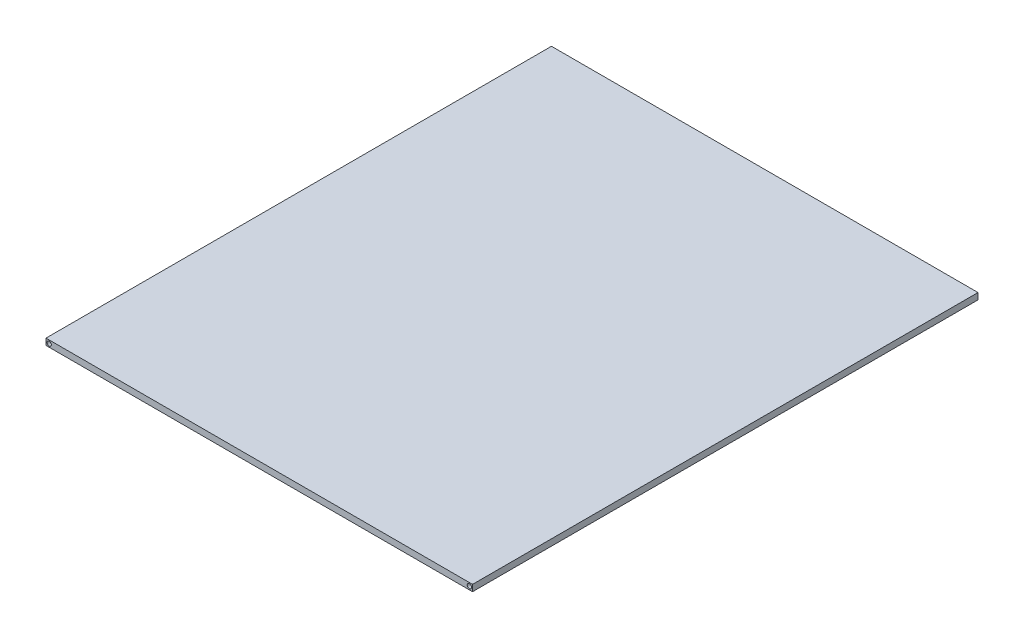
ISO-10303-21;
HEADER;
FILE_DESCRIPTION(('STEP AP214'),'2;1');
FILE_NAME('part.step','',(''),(''),'','','');
FILE_SCHEMA(('AUTOMOTIVE_DESIGN { 1 0 10303 214 1 1 1 1 }'));
ENDSEC;
DATA;
#1=APPLICATION_CONTEXT('core data for automotive mechanical design processes');
#2=APPLICATION_PROTOCOL_DEFINITION('international standard','automotive_design',2000,#1);
#3=PRODUCT_CONTEXT('',#1,'mechanical');
#4=PRODUCT('Part','Part','',(#3));
#5=PRODUCT_RELATED_PRODUCT_CATEGORY('part','',(#4));
#6=PRODUCT_DEFINITION_FORMATION('','',#4);
#7=PRODUCT_DEFINITION_CONTEXT('part definition',#1,'design');
#8=PRODUCT_DEFINITION('design','',#6,#7);
#9=PRODUCT_DEFINITION_SHAPE('','',#8);
#10=(LENGTH_UNIT() NAMED_UNIT(*) SI_UNIT(.MILLI.,.METRE.));
#11=(NAMED_UNIT(*) PLANE_ANGLE_UNIT() SI_UNIT($,.RADIAN.));
#12=(NAMED_UNIT(*) SI_UNIT($,.STERADIAN.) SOLID_ANGLE_UNIT());
#13=UNCERTAINTY_MEASURE_WITH_UNIT(LENGTH_MEASURE(1.E-05),#10,'distance_accuracy_value','');
#14=(GEOMETRIC_REPRESENTATION_CONTEXT(3) GLOBAL_UNCERTAINTY_ASSIGNED_CONTEXT((#13)) GLOBAL_UNIT_ASSIGNED_CONTEXT((#10,
#11,#12)) REPRESENTATION_CONTEXT('',''));
#15=CARTESIAN_POINT('',(0.,0.,0.));
#16=DIRECTION('',(0.,0.,1.));
#17=DIRECTION('',(1.,0.,0.));
#18=AXIS2_PLACEMENT_3D('',#15,#16,#17);
#19=CARTESIAN_POINT('',(0.,3.,0.));
#20=DIRECTION('',(1.,0.,0.));
#21=DIRECTION('',(0.,0.,-1.));
#22=AXIS2_PLACEMENT_3D('',#19,#20,#21);
#23=PLANE('',#22);
#24=DIRECTION('',(0.,0.,1.));
#25=VECTOR('',#24,1.);
#26=CARTESIAN_POINT('',(0.,0.,0.));
#27=LINE('',#26,#25);
#28=CARTESIAN_POINT('',(0.,0.,0.));
#29=VERTEX_POINT('',#28);
#30=CARTESIAN_POINT('',(0.,0.,237.));
#31=VERTEX_POINT('',#30);
#32=EDGE_CURVE('E104',#29,#31,#27,.T.);
#33=ORIENTED_EDGE('',*,*,#32,.T.);
#34=DIRECTION('',(0.,-1.,0.));
#35=VECTOR('',#34,1.);
#36=CARTESIAN_POINT('',(0.,3.,237.));
#37=LINE('',#36,#35);
#38=CARTESIAN_POINT('',(0.,3.,237.));
#39=VERTEX_POINT('',#38);
#40=EDGE_CURVE('E11',#39,#31,#37,.T.);
#41=ORIENTED_EDGE('',*,*,#40,.F.);
#42=DIRECTION('',(0.,0.,1.));
#43=VECTOR('',#42,1.);
#44=CARTESIAN_POINT('',(0.,3.,0.));
#45=LINE('',#44,#43);
#46=CARTESIAN_POINT('',(0.,3.,0.));
#47=VERTEX_POINT('',#46);
#48=EDGE_CURVE('E92',#47,#39,#45,.T.);
#49=ORIENTED_EDGE('',*,*,#48,.F.);
#50=DIRECTION('',(0.,-1.,0.));
#51=VECTOR('',#50,1.);
#52=CARTESIAN_POINT('',(0.,3.,0.));
#53=LINE('',#52,#51);
#54=EDGE_CURVE('E100',#47,#29,#53,.T.);
#55=ORIENTED_EDGE('',*,*,#54,.T.);
#56=EDGE_LOOP('',(#33,#41,#49,#55));
#57=FACE_BOUND('',#56,.T.);
#58=ADVANCED_FACE('F41',(#57),#23,.F.);
#59=CARTESIAN_POINT('',(0.,3.,237.));
#60=DIRECTION('',(0.,0.,-1.));
#61=DIRECTION('',(-1.,0.,0.));
#62=AXIS2_PLACEMENT_3D('',#59,#60,#61);
#63=PLANE('',#62);
#64=CARTESIAN_POINT('',(1.50000000000003,1.5,237.));
#65=DIRECTION('',(0.,0.,1.));
#66=DIRECTION('',(1.,0.,0.));
#67=AXIS2_PLACEMENT_3D('',#64,#65,#66);
#68=CIRCLE('',#67,0.995052607373883);
#69=CARTESIAN_POINT('',(2.49505260737391,1.5,237.));
#70=VERTEX_POINT('',#69);
#71=EDGE_CURVE('E125',#70,#70,#68,.T.);
#72=ORIENTED_EDGE('',*,*,#71,.F.);
#73=EDGE_LOOP('',(#72));
#74=FACE_BOUND('',#73,.T.);
#75=CARTESIAN_POINT('',(198.5,1.5,237.));
#76=DIRECTION('',(0.,0.,1.));
#77=DIRECTION('',(1.,0.,0.));
#78=AXIS2_PLACEMENT_3D('',#75,#76,#77);
#79=CIRCLE('',#78,0.999999999999998);
#80=CARTESIAN_POINT('',(199.5,1.5,237.));
#81=VERTEX_POINT('',#80);
#82=EDGE_CURVE('E121',#81,#81,#79,.T.);
#83=ORIENTED_EDGE('',*,*,#82,.F.);
#84=EDGE_LOOP('',(#83));
#85=FACE_BOUND('',#84,.T.);
#86=DIRECTION('',(1.,0.,0.));
#87=VECTOR('',#86,1.);
#88=CARTESIAN_POINT('',(0.,0.,237.));
#89=LINE('',#88,#87);
#90=CARTESIAN_POINT('',(200.,0.,237.));
#91=VERTEX_POINT('',#90);
#92=EDGE_CURVE('E96',#31,#91,#89,.T.);
#93=ORIENTED_EDGE('',*,*,#92,.T.);
#94=DIRECTION('',(0.,-1.,0.));
#95=VECTOR('',#94,1.);
#96=CARTESIAN_POINT('',(200.,3.,237.));
#97=LINE('',#96,#95);
#98=CARTESIAN_POINT('',(200.,3.,237.));
#99=VERTEX_POINT('',#98);
#100=EDGE_CURVE('E49',#99,#91,#97,.T.);
#101=ORIENTED_EDGE('',*,*,#100,.F.);
#102=DIRECTION('',(1.,0.,0.));
#103=VECTOR('',#102,1.);
#104=CARTESIAN_POINT('',(0.,3.,237.));
#105=LINE('',#104,#103);
#106=EDGE_CURVE('E87',#39,#99,#105,.T.);
#107=ORIENTED_EDGE('',*,*,#106,.F.);
#108=ORIENTED_EDGE('',*,*,#40,.T.);
#109=EDGE_LOOP('',(#93,#101,#107,#108));
#110=FACE_BOUND('',#109,.T.);
#111=ADVANCED_FACE('F95',(#74,#85,#110),#63,.F.);
#112=CARTESIAN_POINT('',(200.,3.,0.));
#113=DIRECTION('',(-1.,0.,0.));
#114=DIRECTION('',(0.,0.,1.));
#115=AXIS2_PLACEMENT_3D('',#112,#113,#114);
#116=PLANE('',#115);
#117=DIRECTION('',(0.,0.,-1.));
#118=VECTOR('',#117,1.);
#119=CARTESIAN_POINT('',(200.,0.,0.));
#120=LINE('',#119,#118);
#121=CARTESIAN_POINT('',(200.,0.,0.));
#122=VERTEX_POINT('',#121);
#123=EDGE_CURVE('E74',#91,#122,#120,.T.);
#124=ORIENTED_EDGE('',*,*,#123,.T.);
#125=DIRECTION('',(0.,-1.,0.));
#126=VECTOR('',#125,1.);
#127=CARTESIAN_POINT('',(200.,3.,0.));
#128=LINE('',#127,#126);
#129=CARTESIAN_POINT('',(200.,3.,0.));
#130=VERTEX_POINT('',#129);
#131=EDGE_CURVE('E97',#130,#122,#128,.T.);
#132=ORIENTED_EDGE('',*,*,#131,.F.);
#133=DIRECTION('',(0.,0.,-1.));
#134=VECTOR('',#133,1.);
#135=CARTESIAN_POINT('',(200.,3.,0.));
#136=LINE('',#135,#134);
#137=EDGE_CURVE('E90',#99,#130,#136,.T.);
#138=ORIENTED_EDGE('',*,*,#137,.F.);
#139=ORIENTED_EDGE('',*,*,#100,.T.);
#140=EDGE_LOOP('',(#124,#132,#138,#139));
#141=FACE_BOUND('',#140,.T.);
#142=ADVANCED_FACE('F98',(#141),#116,.F.);
#143=CARTESIAN_POINT('',(0.,3.,0.));
#144=DIRECTION('',(0.,0.,1.));
#145=DIRECTION('',(1.,0.,0.));
#146=AXIS2_PLACEMENT_3D('',#143,#144,#145);
#147=PLANE('',#146);
#148=CARTESIAN_POINT('',(1.50000000000003,1.5,0.));
#149=DIRECTION('',(0.,0.,1.));
#150=DIRECTION('',(1.,0.,0.));
#151=AXIS2_PLACEMENT_3D('',#148,#149,#150);
#152=CIRCLE('',#151,0.995052607373883);
#153=CARTESIAN_POINT('',(2.49505260737391,1.5,0.));
#154=VERTEX_POINT('',#153);
#155=EDGE_CURVE('E136',#154,#154,#152,.T.);
#156=ORIENTED_EDGE('',*,*,#155,.T.);
#157=EDGE_LOOP('',(#156));
#158=FACE_BOUND('',#157,.T.);
#159=CARTESIAN_POINT('',(198.5,1.5,0.));
#160=DIRECTION('',(0.,0.,1.));
#161=DIRECTION('',(1.,0.,0.));
#162=AXIS2_PLACEMENT_3D('',#159,#160,#161);
#163=CIRCLE('',#162,0.999999999999998);
#164=CARTESIAN_POINT('',(199.5,1.5,0.));
#165=VERTEX_POINT('',#164);
#166=EDGE_CURVE('E130',#165,#165,#163,.T.);
#167=ORIENTED_EDGE('',*,*,#166,.T.);
#168=EDGE_LOOP('',(#167));
#169=FACE_BOUND('',#168,.T.);
#170=DIRECTION('',(-1.,0.,0.));
#171=VECTOR('',#170,1.);
#172=CARTESIAN_POINT('',(0.,0.,0.));
#173=LINE('',#172,#171);
#174=EDGE_CURVE('E80',#122,#29,#173,.T.);
#175=ORIENTED_EDGE('',*,*,#174,.T.);
#176=ORIENTED_EDGE('',*,*,#54,.F.);
#177=DIRECTION('',(-1.,0.,0.));
#178=VECTOR('',#177,1.);
#179=CARTESIAN_POINT('',(0.,3.,0.));
#180=LINE('',#179,#178);
#181=EDGE_CURVE('E57',#130,#47,#180,.T.);
#182=ORIENTED_EDGE('',*,*,#181,.F.);
#183=ORIENTED_EDGE('',*,*,#131,.T.);
#184=EDGE_LOOP('',(#175,#176,#182,#183));
#185=FACE_BOUND('',#184,.T.);
#186=ADVANCED_FACE('F112',(#158,#169,#185),#147,.F.);
#187=CARTESIAN_POINT('',(0.,3.,0.));
#188=DIRECTION('',(0.,1.,0.));
#189=DIRECTION('',(0.,0.,1.));
#190=AXIS2_PLACEMENT_3D('',#187,#188,#189);
#191=PLANE('',#190);
#192=ORIENTED_EDGE('',*,*,#48,.T.);
#193=ORIENTED_EDGE('',*,*,#106,.T.);
#194=ORIENTED_EDGE('',*,*,#137,.T.);
#195=ORIENTED_EDGE('',*,*,#181,.T.);
#196=EDGE_LOOP('',(#192,#193,#194,#195));
#197=FACE_BOUND('',#196,.T.);
#198=ADVANCED_FACE('F88',(#197),#191,.T.);
#199=CARTESIAN_POINT('',(0.,0.,0.));
#200=DIRECTION('',(0.,1.,0.));
#201=DIRECTION('',(0.,0.,1.));
#202=AXIS2_PLACEMENT_3D('',#199,#200,#201);
#203=PLANE('',#202);
#204=ORIENTED_EDGE('',*,*,#32,.F.);
#205=ORIENTED_EDGE('',*,*,#174,.F.);
#206=ORIENTED_EDGE('',*,*,#123,.F.);
#207=ORIENTED_EDGE('',*,*,#92,.F.);
#208=EDGE_LOOP('',(#204,#205,#206,#207));
#209=FACE_BOUND('',#208,.T.);
#210=ADVANCED_FACE('F115',(#209),#203,.F.);
#211=CARTESIAN_POINT('',(198.5,1.5,227.));
#212=DIRECTION('',(0.,0.,1.));
#213=DIRECTION('',(1.,0.,0.));
#214=AXIS2_PLACEMENT_3D('',#211,#212,#213);
#215=CYLINDRICAL_SURFACE('',#214,0.999999999999998);
#216=CARTESIAN_POINT('',(198.5,1.5,227.));
#217=DIRECTION('',(0.,0.,1.));
#218=DIRECTION('',(1.,0.,0.));
#219=AXIS2_PLACEMENT_3D('',#216,#217,#218);
#220=CIRCLE('',#219,0.999999999999998);
#221=CARTESIAN_POINT('',(199.5,1.5,227.));
#222=VERTEX_POINT('',#221);
#223=EDGE_CURVE('E118',#222,#222,#220,.T.);
#224=ORIENTED_EDGE('',*,*,#223,.F.);
#225=EDGE_LOOP('',(#224));
#226=FACE_BOUND('',#225,.T.);
#227=ORIENTED_EDGE('',*,*,#82,.T.);
#228=EDGE_LOOP('',(#227));
#229=FACE_BOUND('',#228,.T.);
#230=ADVANCED_FACE('F171',(#226,#229),#215,.F.);
#231=CARTESIAN_POINT('',(198.5,1.5,227.));
#232=DIRECTION('',(0.,0.,1.));
#233=DIRECTION('',(1.,0.,0.));
#234=AXIS2_PLACEMENT_3D('',#231,#232,#233);
#235=PLANE('',#234);
#236=ORIENTED_EDGE('',*,*,#223,.T.);
#237=EDGE_LOOP('',(#236));
#238=FACE_BOUND('',#237,.T.);
#239=ADVANCED_FACE('F174',(#238),#235,.T.);
#240=CARTESIAN_POINT('',(1.50000000000003,1.5,227.));
#241=DIRECTION('',(0.,0.,1.));
#242=DIRECTION('',(1.,0.,0.));
#243=AXIS2_PLACEMENT_3D('',#240,#241,#242);
#244=CYLINDRICAL_SURFACE('',#243,0.995052607373883);
#245=CARTESIAN_POINT('',(1.50000000000003,1.5,227.));
#246=DIRECTION('',(0.,0.,1.));
#247=DIRECTION('',(1.,0.,0.));
#248=AXIS2_PLACEMENT_3D('',#245,#246,#247);
#249=CIRCLE('',#248,0.995052607373883);
#250=CARTESIAN_POINT('',(2.49505260737391,1.5,227.));
#251=VERTEX_POINT('',#250);
#252=EDGE_CURVE('E107',#251,#251,#249,.T.);
#253=ORIENTED_EDGE('',*,*,#252,.F.);
#254=EDGE_LOOP('',(#253));
#255=FACE_BOUND('',#254,.T.);
#256=ORIENTED_EDGE('',*,*,#71,.T.);
#257=EDGE_LOOP('',(#256));
#258=FACE_BOUND('',#257,.T.);
#259=ADVANCED_FACE('F177',(#255,#258),#244,.F.);
#260=CARTESIAN_POINT('',(1.50000000000003,1.5,227.));
#261=DIRECTION('',(0.,0.,1.));
#262=DIRECTION('',(1.,0.,0.));
#263=AXIS2_PLACEMENT_3D('',#260,#261,#262);
#264=PLANE('',#263);
#265=ORIENTED_EDGE('',*,*,#252,.T.);
#266=EDGE_LOOP('',(#265));
#267=FACE_BOUND('',#266,.T.);
#268=ADVANCED_FACE('F183',(#267),#264,.T.);
#269=CARTESIAN_POINT('',(198.5,1.5,10.));
#270=DIRECTION('',(0.,0.,-1.));
#271=DIRECTION('',(-1.,0.,0.));
#272=AXIS2_PLACEMENT_3D('',#269,#270,#271);
#273=CYLINDRICAL_SURFACE('',#272,0.999999999999998);
#274=CARTESIAN_POINT('',(198.5,1.5,10.));
#275=DIRECTION('',(0.,0.,1.));
#276=DIRECTION('',(1.,0.,0.));
#277=AXIS2_PLACEMENT_3D('',#274,#275,#276);
#278=CIRCLE('',#277,0.999999999999998);
#279=CARTESIAN_POINT('',(199.5,1.5,10.));
#280=VERTEX_POINT('',#279);
#281=EDGE_CURVE('E133',#280,#280,#278,.T.);
#282=ORIENTED_EDGE('',*,*,#281,.T.);
#283=EDGE_LOOP('',(#282));
#284=FACE_BOUND('',#283,.T.);
#285=ORIENTED_EDGE('',*,*,#166,.F.);
#286=EDGE_LOOP('',(#285));
#287=FACE_BOUND('',#286,.T.);
#288=ADVANCED_FACE('F187',(#284,#287),#273,.F.);
#289=CARTESIAN_POINT('',(198.5,1.5,10.));
#290=DIRECTION('',(0.,0.,-1.));
#291=DIRECTION('',(1.,0.,0.));
#292=AXIS2_PLACEMENT_3D('',#289,#290,#291);
#293=PLANE('',#292);
#294=ORIENTED_EDGE('',*,*,#281,.F.);
#295=EDGE_LOOP('',(#294));
#296=FACE_BOUND('',#295,.T.);
#297=ADVANCED_FACE('F151',(#296),#293,.T.);
#298=CARTESIAN_POINT('',(1.50000000000003,1.5,10.));
#299=DIRECTION('',(0.,0.,-1.));
#300=DIRECTION('',(-1.,0.,0.));
#301=AXIS2_PLACEMENT_3D('',#298,#299,#300);
#302=CYLINDRICAL_SURFACE('',#301,0.995052607373883);
#303=CARTESIAN_POINT('',(1.50000000000003,1.5,10.));
#304=DIRECTION('',(0.,0.,1.));
#305=DIRECTION('',(1.,0.,0.));
#306=AXIS2_PLACEMENT_3D('',#303,#304,#305);
#307=CIRCLE('',#306,0.995052607373883);
#308=CARTESIAN_POINT('',(2.49505260737391,1.5,10.));
#309=VERTEX_POINT('',#308);
#310=EDGE_CURVE('E122',#309,#309,#307,.T.);
#311=ORIENTED_EDGE('',*,*,#310,.T.);
#312=EDGE_LOOP('',(#311));
#313=FACE_BOUND('',#312,.T.);
#314=ORIENTED_EDGE('',*,*,#155,.F.);
#315=EDGE_LOOP('',(#314));
#316=FACE_BOUND('',#315,.T.);
#317=ADVANCED_FACE('F142',(#313,#316),#302,.F.);
#318=CARTESIAN_POINT('',(1.50000000000003,1.5,10.));
#319=DIRECTION('',(0.,0.,-1.));
#320=DIRECTION('',(1.,0.,0.));
#321=AXIS2_PLACEMENT_3D('',#318,#319,#320);
#322=PLANE('',#321);
#323=ORIENTED_EDGE('',*,*,#310,.F.);
#324=EDGE_LOOP('',(#323));
#325=FACE_BOUND('',#324,.T.);
#326=ADVANCED_FACE('F145',(#325),#322,.T.);
#327=CLOSED_SHELL('',(#58,#111,#142,#186,#198,#210,#230,#239,#259,#268,#288,#297,#317,#326));
#328=MANIFOLD_SOLID_BREP('B2',#327);
#329=ADVANCED_BREP_SHAPE_REPRESENTATION('',(#18,#328),#14);
#330=SHAPE_DEFINITION_REPRESENTATION(#9,#329);
ENDSEC;
END-ISO-10303-21;
